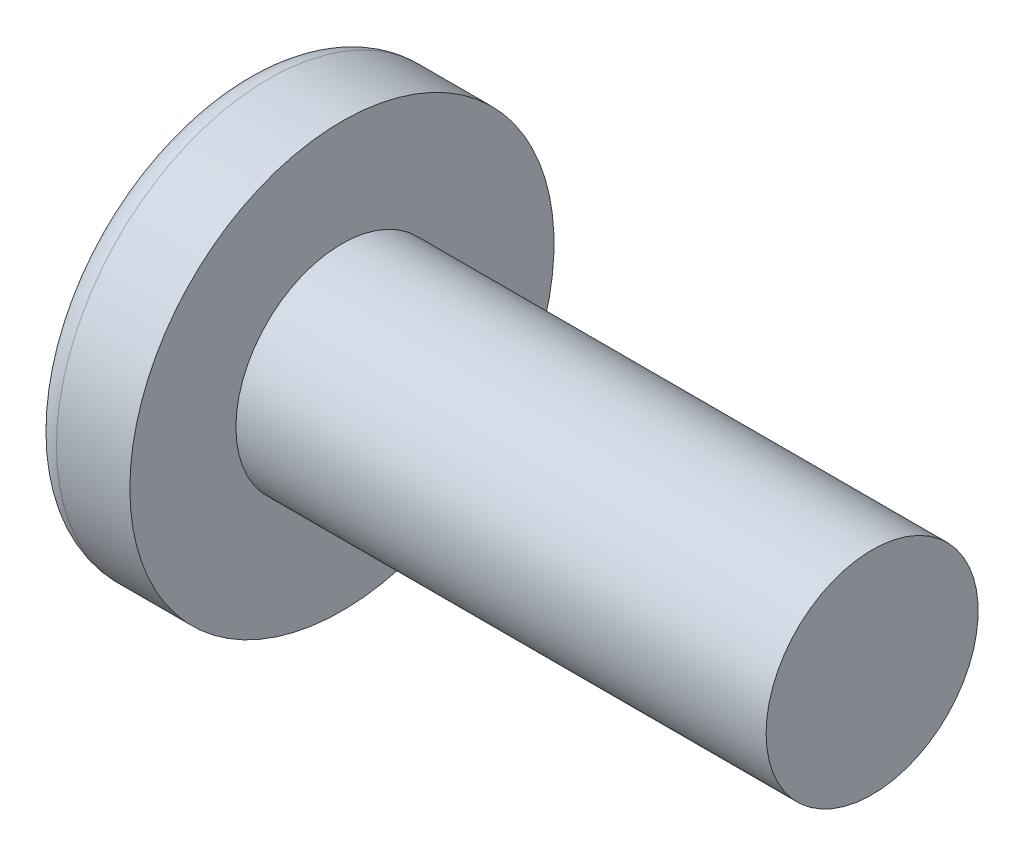
ISO-10303-21;
HEADER;
FILE_DESCRIPTION(('STEP AP214'),'2;1');
FILE_NAME('part.step','',(''),(''),'','','');
FILE_SCHEMA(('AUTOMOTIVE_DESIGN { 1 0 10303 214 1 1 1 1 }'));
ENDSEC;
DATA;
#1=APPLICATION_CONTEXT('core data for automotive mechanical design processes');
#2=APPLICATION_PROTOCOL_DEFINITION('international standard','automotive_design',2000,#1);
#3=PRODUCT_CONTEXT('',#1,'mechanical');
#4=PRODUCT('Part','Part','',(#3));
#5=PRODUCT_RELATED_PRODUCT_CATEGORY('part','',(#4));
#6=PRODUCT_DEFINITION_FORMATION('','',#4);
#7=PRODUCT_DEFINITION_CONTEXT('part definition',#1,'design');
#8=PRODUCT_DEFINITION('design','',#6,#7);
#9=PRODUCT_DEFINITION_SHAPE('','',#8);
#10=(LENGTH_UNIT() NAMED_UNIT(*) SI_UNIT(.MILLI.,.METRE.));
#11=(NAMED_UNIT(*) PLANE_ANGLE_UNIT() SI_UNIT($,.RADIAN.));
#12=(NAMED_UNIT(*) SI_UNIT($,.STERADIAN.) SOLID_ANGLE_UNIT());
#13=UNCERTAINTY_MEASURE_WITH_UNIT(LENGTH_MEASURE(1.E-05),#10,'distance_accuracy_value','');
#14=(GEOMETRIC_REPRESENTATION_CONTEXT(3) GLOBAL_UNCERTAINTY_ASSIGNED_CONTEXT((#13)) GLOBAL_UNIT_ASSIGNED_CONTEXT((#10,
#11,#12)) REPRESENTATION_CONTEXT('',''));
#15=CARTESIAN_POINT('',(0.,0.,0.));
#16=DIRECTION('',(0.,0.,1.));
#17=DIRECTION('',(1.,0.,0.));
#18=AXIS2_PLACEMENT_3D('',#15,#16,#17);
#19=CARTESIAN_POINT('',(13.,0.,0.));
#20=DIRECTION('',(-1.,0.,0.));
#21=DIRECTION('',(0.,1.,0.));
#22=AXIS2_PLACEMENT_3D('',#19,#20,#21);
#23=SPHERICAL_SURFACE('',#22,13.);
#24=CARTESIAN_POINT('',(2.45392021182909,0.,0.));
#25=DIRECTION('',(-1.,0.,0.));
#26=DIRECTION('',(0.,0.,1.));
#27=AXIS2_PLACEMENT_3D('',#24,#25,#26);
#28=CIRCLE('',#27,7.60132890365449);
#29=CARTESIAN_POINT('',(2.45392021182909,0.,7.60132890365449));
#30=VERTEX_POINT('',#29);
#31=EDGE_CURVE('E153',#30,#30,#28,.T.);
#32=ORIENTED_EDGE('',*,*,#31,.T.);
#33=EDGE_LOOP('',(#32));
#34=FACE_BOUND('',#33,.T.);
#35=CARTESIAN_POINT('',(12.9758945313263,-0.27842529497651,0.));
#36=DIRECTION('',(-0.0862551996530427,-0.996273075282482,0.));
#37=DIRECTION('',(0.996273075282482,-0.0862551996530427,0.));
#38=AXIS2_PLACEMENT_3D('',#35,#36,#37);
#39=CIRCLE('',#38,12.9969957406124);
#40=CARTESIAN_POINT('',(0.645878886985406,0.789081182427992,3.96901025603426));
#41=VERTEX_POINT('',#40);
#42=CARTESIAN_POINT('',(0.0544280526445055,0.840287735196246,0.840287735196249));
#43=VERTEX_POINT('',#42);
#44=EDGE_CURVE('E184',#41,#43,#39,.T.);
#45=ORIENTED_EDGE('',*,*,#44,.F.);
#46=CARTESIAN_POINT('',(9.86001716040755,0.,-3.7487746195012));
#47=DIRECTION('',(0.642113836175469,0.,0.766609301660254));
#48=DIRECTION('',(0.766609301660254,0.,-0.642113836175469));
#49=AXIS2_PLACEMENT_3D('',#46,#47,#48);
#50=CIRCLE('',#49,12.0452146771757);
#51=CARTESIAN_POINT('',(0.645878886985406,-0.789081182428019,3.96901025603425));
#52=VERTEX_POINT('',#51);
#53=EDGE_CURVE('E149',#41,#52,#50,.T.);
#54=ORIENTED_EDGE('',*,*,#53,.T.);
#55=CARTESIAN_POINT('',(12.9758945313263,0.27842529497651,0.));
#56=DIRECTION('',(-0.0862551996530427,0.996273075282482,0.));
#57=DIRECTION('',(-0.996273075282482,-0.0862551996530427,0.));
#58=AXIS2_PLACEMENT_3D('',#55,#56,#57);
#59=CIRCLE('',#58,12.9969957406124);
#60=CARTESIAN_POINT('',(0.0544280526445073,-0.840287735196252,0.840287735196249));
#61=VERTEX_POINT('',#60);
#62=EDGE_CURVE('E105',#61,#52,#59,.T.);
#63=ORIENTED_EDGE('',*,*,#62,.F.);
#64=CARTESIAN_POINT('',(12.9758945313263,0.,-0.27842529497651));
#65=DIRECTION('',(-0.0862551996530427,0.,-0.996273075282482));
#66=DIRECTION('',(-0.996273075282482,0.,0.0862551996530427));
#67=AXIS2_PLACEMENT_3D('',#64,#65,#66);
#68=CIRCLE('',#67,12.9969957406124);
#69=CARTESIAN_POINT('',(0.645878886985404,-3.96901025603425,0.789081182428005));
#70=VERTEX_POINT('',#69);
#71=EDGE_CURVE('E130',#70,#61,#68,.T.);
#72=ORIENTED_EDGE('',*,*,#71,.F.);
#73=CARTESIAN_POINT('',(9.86001716040755,3.7487746195012,0.));
#74=DIRECTION('',(0.642113836175469,-0.766609301660254,0.));
#75=DIRECTION('',(0.766609301660254,0.642113836175469,0.));
#76=AXIS2_PLACEMENT_3D('',#73,#74,#75);
#77=CIRCLE('',#76,12.0452146771757);
#78=CARTESIAN_POINT('',(0.645878886985404,-3.96901025603425,-0.789081182428005));
#79=VERTEX_POINT('',#78);
#80=EDGE_CURVE('E138',#70,#79,#77,.T.);
#81=ORIENTED_EDGE('',*,*,#80,.T.);
#82=CARTESIAN_POINT('',(12.9758945313263,0.,0.27842529497651));
#83=DIRECTION('',(-0.0862551996530427,0.,0.996273075282482));
#84=DIRECTION('',(0.996273075282482,0.,0.0862551996530427));
#85=AXIS2_PLACEMENT_3D('',#82,#83,#84);
#86=CIRCLE('',#85,12.9969957406124);
#87=CARTESIAN_POINT('',(0.0544280526445055,-0.840287735196246,-0.840287735196249));
#88=VERTEX_POINT('',#87);
#89=EDGE_CURVE('E48',#88,#79,#86,.T.);
#90=ORIENTED_EDGE('',*,*,#89,.F.);
#91=CARTESIAN_POINT('',(0.645878886985406,-0.789081182427991,-3.96901025603426));
#92=VERTEX_POINT('',#91);
#93=EDGE_CURVE('E191',#92,#88,#59,.T.);
#94=ORIENTED_EDGE('',*,*,#93,.F.);
#95=CARTESIAN_POINT('',(9.86001716040755,0.,3.7487746195012));
#96=DIRECTION('',(0.642113836175469,0.,-0.766609301660254));
#97=DIRECTION('',(-0.766609301660254,0.,-0.642113836175469));
#98=AXIS2_PLACEMENT_3D('',#95,#96,#97);
#99=CIRCLE('',#98,12.0452146771757);
#100=CARTESIAN_POINT('',(0.645878886985406,0.789081182428019,-3.96901025603425));
#101=VERTEX_POINT('',#100);
#102=EDGE_CURVE('E131',#92,#101,#99,.T.);
#103=ORIENTED_EDGE('',*,*,#102,.T.);
#104=CARTESIAN_POINT('',(0.0544280526445073,0.840287735196252,-0.840287735196249));
#105=VERTEX_POINT('',#104);
#106=EDGE_CURVE('E179',#105,#101,#39,.T.);
#107=ORIENTED_EDGE('',*,*,#106,.F.);
#108=CARTESIAN_POINT('',(0.645878886985406,3.96901025603425,-0.789081182428005));
#109=VERTEX_POINT('',#108);
#110=EDGE_CURVE('E41',#109,#105,#86,.T.);
#111=ORIENTED_EDGE('',*,*,#110,.F.);
#112=CARTESIAN_POINT('',(9.86001716040755,-3.7487746195012,0.));
#113=DIRECTION('',(0.642113836175469,0.766609301660254,0.));
#114=DIRECTION('',(-0.766609301660254,0.642113836175469,0.));
#115=AXIS2_PLACEMENT_3D('',#112,#113,#114);
#116=CIRCLE('',#115,12.0452146771757);
#117=CARTESIAN_POINT('',(0.645878886985406,3.96901025603425,0.789081182428006));
#118=VERTEX_POINT('',#117);
#119=EDGE_CURVE('E11',#109,#118,#116,.T.);
#120=ORIENTED_EDGE('',*,*,#119,.T.);
#121=EDGE_CURVE('E167',#43,#118,#68,.T.);
#122=ORIENTED_EDGE('',*,*,#121,.F.);
#123=EDGE_LOOP('',(#45,#54,#63,#72,#81,#90,#94,#103,#107,#111,#120,#122));
#124=FACE_BOUND('',#123,.T.);
#125=ADVANCED_FACE('F33',(#34,#124),#23,.T.);
#126=CARTESIAN_POINT('',(5.38441590214067,0.,-0.37882874617737));
#127=DIRECTION('',(-0.0862551996530427,0.,0.996273075282482));
#128=DIRECTION('',(0.996273075282482,0.,0.0862551996530427));
#129=AXIS2_PLACEMENT_3D('',#126,#127,#128);
#130=PLANE('',#129);
#131=ORIENTED_EDGE('',*,*,#110,.T.);
#132=DIRECTION('',(0.992587512259711,-0.0859361114610101,0.0859361114610098));
#133=VECTOR('',#132,1.);
#134=CARTESIAN_POINT('',(5.41672965744432,0.376031090108562,-0.37603109010856));
#135=LINE('',#134,#133);
#136=CARTESIAN_POINT('',(4.88,0.422500000000001,-0.422499999999998));
#137=VERTEX_POINT('',#136);
#138=EDGE_CURVE('E173',#105,#137,#135,.T.);
#139=ORIENTED_EDGE('',*,*,#138,.T.);
#140=DIRECTION('',(0.764926340567859,-0.64070418382605,0.0662256923954755));
#141=VECTOR('',#140,1.);
#142=CARTESIAN_POINT('',(0.,4.51,-0.845));
#143=LINE('',#142,#141);
#144=EDGE_CURVE('E154',#109,#137,#143,.T.);
#145=ORIENTED_EDGE('',*,*,#144,.F.);
#146=EDGE_LOOP('',(#131,#139,#145));
#147=FACE_BOUND('',#146,.T.);
#148=ADVANCED_FACE('F172',(#147),#130,.T.);
#149=DIRECTION('',(0.764926340567859,0.64070418382605,0.0662256923954755));
#150=VECTOR('',#149,1.);
#151=CARTESIAN_POINT('',(0.,-4.51,-0.845));
#152=LINE('',#151,#150);
#153=CARTESIAN_POINT('',(4.88,-0.4225,-0.4225));
#154=VERTEX_POINT('',#153);
#155=EDGE_CURVE('E139',#79,#154,#152,.T.);
#156=ORIENTED_EDGE('',*,*,#155,.T.);
#157=DIRECTION('',(-0.992587512259711,-0.0859361114610095,-0.0859361114610098));
#158=VECTOR('',#157,1.);
#159=CARTESIAN_POINT('',(5.41672965744432,-0.376031090108559,-0.37603109010856));
#160=LINE('',#159,#158);
#161=EDGE_CURVE('E194',#154,#88,#160,.T.);
#162=ORIENTED_EDGE('',*,*,#161,.T.);
#163=ORIENTED_EDGE('',*,*,#89,.T.);
#164=EDGE_LOOP('',(#156,#162,#163));
#165=FACE_BOUND('',#164,.T.);
#166=ADVANCED_FACE('F209',(#165),#130,.T.);
#167=CARTESIAN_POINT('',(5.38441590214067,0.,0.37882874617737));
#168=DIRECTION('',(-0.0862551996530427,0.,-0.996273075282482));
#169=DIRECTION('',(-0.996273075282482,0.,0.0862551996530427));
#170=AXIS2_PLACEMENT_3D('',#167,#168,#169);
#171=PLANE('',#170);
#172=DIRECTION('',(0.764926340567859,-0.64070418382605,-0.0662256923954755));
#173=VECTOR('',#172,1.);
#174=CARTESIAN_POINT('',(0.,4.51,0.845));
#175=LINE('',#174,#173);
#176=CARTESIAN_POINT('',(4.88,0.4225,0.4225));
#177=VERTEX_POINT('',#176);
#178=EDGE_CURVE('E210',#118,#177,#175,.T.);
#179=ORIENTED_EDGE('',*,*,#178,.T.);
#180=DIRECTION('',(-0.992587512259711,0.0859361114610095,0.0859361114610098));
#181=VECTOR('',#180,1.);
#182=CARTESIAN_POINT('',(5.41672965744432,0.376031090108559,0.37603109010856));
#183=LINE('',#182,#181);
#184=EDGE_CURVE('E188',#177,#43,#183,.T.);
#185=ORIENTED_EDGE('',*,*,#184,.T.);
#186=ORIENTED_EDGE('',*,*,#121,.T.);
#187=EDGE_LOOP('',(#179,#185,#186));
#188=FACE_BOUND('',#187,.T.);
#189=ADVANCED_FACE('F214',(#188),#171,.T.);
#190=ORIENTED_EDGE('',*,*,#71,.T.);
#191=DIRECTION('',(0.992587512259711,0.0859361114610101,-0.0859361114610097));
#192=VECTOR('',#191,1.);
#193=CARTESIAN_POINT('',(5.41672965744432,-0.376031090108562,0.37603109010856));
#194=LINE('',#193,#192);
#195=CARTESIAN_POINT('',(4.88,-0.422500000000001,0.422499999999998));
#196=VERTEX_POINT('',#195);
#197=EDGE_CURVE('E103',#61,#196,#194,.T.);
#198=ORIENTED_EDGE('',*,*,#197,.T.);
#199=DIRECTION('',(0.764926340567859,0.64070418382605,-0.0662256923954754));
#200=VECTOR('',#199,1.);
#201=CARTESIAN_POINT('',(0.,-4.51,0.844999999999999));
#202=LINE('',#201,#200);
#203=EDGE_CURVE('E128',#70,#196,#202,.T.);
#204=ORIENTED_EDGE('',*,*,#203,.F.);
#205=EDGE_LOOP('',(#190,#198,#204));
#206=FACE_BOUND('',#205,.T.);
#207=ADVANCED_FACE('F127',(#206),#171,.T.);
#208=CARTESIAN_POINT('',(-25.4,0.,0.));
#209=DIRECTION('',(-1.,0.,0.));
#210=DIRECTION('',(0.,0.,1.));
#211=AXIS2_PLACEMENT_3D('',#208,#209,#210);
#212=CYLINDRICAL_SURFACE('',#211,4.);
#213=CARTESIAN_POINT('',(26.,0.,0.));
#214=DIRECTION('',(-1.,0.,0.));
#215=DIRECTION('',(0.,0.,1.));
#216=AXIS2_PLACEMENT_3D('',#213,#214,#215);
#217=CIRCLE('',#216,4.);
#218=CARTESIAN_POINT('',(26.,0.,4.));
#219=VERTEX_POINT('',#218);
#220=EDGE_CURVE('E150',#219,#219,#217,.T.);
#221=ORIENTED_EDGE('',*,*,#220,.T.);
#222=EDGE_LOOP('',(#221));
#223=FACE_BOUND('',#222,.T.);
#224=CARTESIAN_POINT('',(6.,0.,0.));
#225=DIRECTION('',(-1.,0.,0.));
#226=DIRECTION('',(0.,0.,1.));
#227=AXIS2_PLACEMENT_3D('',#224,#225,#226);
#228=CIRCLE('',#227,4.);
#229=CARTESIAN_POINT('',(6.,0.,4.));
#230=VERTEX_POINT('',#229);
#231=EDGE_CURVE('E163',#230,#230,#228,.T.);
#232=ORIENTED_EDGE('',*,*,#231,.F.);
#233=EDGE_LOOP('',(#232));
#234=FACE_BOUND('',#233,.T.);
#235=ADVANCED_FACE('F35',(#223,#234),#212,.T.);
#236=CARTESIAN_POINT('',(6.,4.,0.));
#237=DIRECTION('',(-1.,0.,0.));
#238=DIRECTION('',(0.,0.,1.));
#239=AXIS2_PLACEMENT_3D('',#236,#237,#238);
#240=PLANE('',#239);
#241=CARTESIAN_POINT('',(6.,0.,0.));
#242=DIRECTION('',(-1.,0.,0.));
#243=DIRECTION('',(0.,0.,1.));
#244=AXIS2_PLACEMENT_3D('',#241,#242,#243);
#245=CIRCLE('',#244,8.);
#246=CARTESIAN_POINT('',(6.,0.,8.));
#247=VERTEX_POINT('',#246);
#248=EDGE_CURVE('E160',#247,#247,#245,.T.);
#249=ORIENTED_EDGE('',*,*,#248,.F.);
#250=EDGE_LOOP('',(#249));
#251=FACE_BOUND('',#250,.T.);
#252=ORIENTED_EDGE('',*,*,#231,.T.);
#253=EDGE_LOOP('',(#252));
#254=FACE_BOUND('',#253,.T.);
#255=ADVANCED_FACE('F242',(#251,#254),#240,.F.);
#256=CARTESIAN_POINT('',(-25.4,0.,0.));
#257=DIRECTION('',(-1.,0.,0.));
#258=DIRECTION('',(0.,0.,1.));
#259=AXIS2_PLACEMENT_3D('',#256,#257,#258);
#260=CYLINDRICAL_SURFACE('',#259,8.);
#261=ORIENTED_EDGE('',*,*,#248,.T.);
#262=EDGE_LOOP('',(#261));
#263=FACE_BOUND('',#262,.T.);
#264=CARTESIAN_POINT('',(3.23270764234018,0.,0.));
#265=DIRECTION('',(-1.,0.,0.));
#266=DIRECTION('',(0.,0.,1.));
#267=AXIS2_PLACEMENT_3D('',#264,#265,#266);
#268=CIRCLE('',#267,8.);
#269=CARTESIAN_POINT('',(3.23270764234018,0.,8.));
#270=VERTEX_POINT('',#269);
#271=EDGE_CURVE('E157',#270,#270,#268,.T.);
#272=ORIENTED_EDGE('',*,*,#271,.F.);
#273=EDGE_LOOP('',(#272));
#274=FACE_BOUND('',#273,.T.);
#275=ADVANCED_FACE('F239',(#263,#274),#260,.T.);
#276=CARTESIAN_POINT('',(3.23270764234018,0.,0.));
#277=DIRECTION('',(-1.,0.,0.));
#278=DIRECTION('',(0.,0.,1.));
#279=AXIS2_PLACEMENT_3D('',#276,#277,#278);
#280=TOROIDAL_SURFACE('',#279,7.04,0.960000000000001);
#281=ORIENTED_EDGE('',*,*,#271,.T.);
#282=EDGE_LOOP('',(#281));
#283=FACE_BOUND('',#282,.T.);
#284=ORIENTED_EDGE('',*,*,#31,.F.);
#285=EDGE_LOOP('',(#284));
#286=FACE_BOUND('',#285,.T.);
#287=ADVANCED_FACE('F236',(#283,#286),#280,.T.);
#288=CARTESIAN_POINT('',(26.,4.,0.));
#289=DIRECTION('',(1.,0.,0.));
#290=DIRECTION('',(0.,0.,-1.));
#291=AXIS2_PLACEMENT_3D('',#288,#289,#290);
#292=PLANE('',#291);
#293=ORIENTED_EDGE('',*,*,#220,.F.);
#294=EDGE_LOOP('',(#293));
#295=FACE_BOUND('',#294,.T.);
#296=ADVANCED_FACE('F234',(#295),#292,.T.);
#297=CARTESIAN_POINT('',(4.88,0.4225,0.4225));
#298=DIRECTION('',(0.642113836175469,0.766609301660254,0.));
#299=DIRECTION('',(-0.766609301660254,0.642113836175469,0.));
#300=AXIS2_PLACEMENT_3D('',#297,#298,#299);
#301=PLANE('',#300);
#302=ORIENTED_EDGE('',*,*,#144,.T.);
#303=DIRECTION('',(0.,0.,-1.));
#304=VECTOR('',#303,1.);
#305=CARTESIAN_POINT('',(4.88,0.4225,0.4225));
#306=LINE('',#305,#304);
#307=EDGE_CURVE('E121',#177,#137,#306,.T.);
#308=ORIENTED_EDGE('',*,*,#307,.F.);
#309=ORIENTED_EDGE('',*,*,#178,.F.);
#310=ORIENTED_EDGE('',*,*,#119,.F.);
#311=EDGE_LOOP('',(#302,#308,#309,#310));
#312=FACE_BOUND('',#311,.T.);
#313=ADVANCED_FACE('F213',(#312),#301,.F.);
#314=CARTESIAN_POINT('',(4.88,-0.4225,-0.4225));
#315=DIRECTION('',(0.642113836175469,-0.766609301660254,0.));
#316=DIRECTION('',(0.766609301660254,0.642113836175469,0.));
#317=AXIS2_PLACEMENT_3D('',#314,#315,#316);
#318=PLANE('',#317);
#319=ORIENTED_EDGE('',*,*,#203,.T.);
#320=DIRECTION('',(0.,0.,1.));
#321=VECTOR('',#320,1.);
#322=CARTESIAN_POINT('',(4.88,-0.4225,-0.4225));
#323=LINE('',#322,#321);
#324=EDGE_CURVE('E120',#154,#196,#323,.T.);
#325=ORIENTED_EDGE('',*,*,#324,.F.);
#326=ORIENTED_EDGE('',*,*,#155,.F.);
#327=ORIENTED_EDGE('',*,*,#80,.F.);
#328=EDGE_LOOP('',(#319,#325,#326,#327));
#329=FACE_BOUND('',#328,.T.);
#330=ADVANCED_FACE('F135',(#329),#318,.F.);
#331=CARTESIAN_POINT('',(4.88,0.4225,-0.4225));
#332=DIRECTION('',(-1.,0.,0.));
#333=DIRECTION('',(0.,0.,1.));
#334=AXIS2_PLACEMENT_3D('',#331,#332,#333);
#335=PLANE('',#334);
#336=DIRECTION('',(0.,1.,0.));
#337=VECTOR('',#336,1.);
#338=CARTESIAN_POINT('',(4.88,-0.4225,-0.4225));
#339=LINE('',#338,#337);
#340=EDGE_CURVE('E143',#154,#137,#339,.T.);
#341=ORIENTED_EDGE('',*,*,#340,.F.);
#342=ORIENTED_EDGE('',*,*,#324,.T.);
#343=DIRECTION('',(0.,-1.,0.));
#344=VECTOR('',#343,1.);
#345=CARTESIAN_POINT('',(4.88,0.4225,0.4225));
#346=LINE('',#345,#344);
#347=EDGE_CURVE('E112',#177,#196,#346,.T.);
#348=ORIENTED_EDGE('',*,*,#347,.F.);
#349=ORIENTED_EDGE('',*,*,#307,.T.);
#350=EDGE_LOOP('',(#341,#342,#348,#349));
#351=FACE_BOUND('',#350,.T.);
#352=ADVANCED_FACE('F141',(#351),#335,.T.);
#353=CARTESIAN_POINT('',(4.88,0.422500000000001,-0.422499999999998));
#354=DIRECTION('',(0.642113836175469,0.,-0.766609301660254));
#355=DIRECTION('',(0.766609301660254,0.,0.642113836175469));
#356=AXIS2_PLACEMENT_3D('',#353,#354,#355);
#357=PLANE('',#356);
#358=DIRECTION('',(0.764926340567859,0.0662256923954731,0.64070418382605));
#359=VECTOR('',#358,1.);
#360=CARTESIAN_POINT('',(0.,-0.844999999999983,-4.51));
#361=LINE('',#360,#359);
#362=EDGE_CURVE('E199',#92,#154,#361,.T.);
#363=ORIENTED_EDGE('',*,*,#362,.T.);
#364=ORIENTED_EDGE('',*,*,#340,.T.);
#365=DIRECTION('',(0.764926340567859,-0.0662256923954777,0.640704183826049));
#366=VECTOR('',#365,1.);
#367=CARTESIAN_POINT('',(0.,0.845000000000016,-4.51));
#368=LINE('',#367,#366);
#369=EDGE_CURVE('E109',#101,#137,#368,.T.);
#370=ORIENTED_EDGE('',*,*,#369,.F.);
#371=ORIENTED_EDGE('',*,*,#102,.F.);
#372=EDGE_LOOP('',(#363,#364,#370,#371));
#373=FACE_BOUND('',#372,.T.);
#374=ADVANCED_FACE('F204',(#373),#357,.F.);
#375=CARTESIAN_POINT('',(5.38441590214067,-0.37882874617737,0.));
#376=DIRECTION('',(-0.0862551996530427,0.996273075282482,0.));
#377=DIRECTION('',(-0.996273075282482,-0.0862551996530427,0.));
#378=AXIS2_PLACEMENT_3D('',#375,#376,#377);
#379=PLANE('',#378);
#380=ORIENTED_EDGE('',*,*,#93,.T.);
#381=ORIENTED_EDGE('',*,*,#161,.F.);
#382=ORIENTED_EDGE('',*,*,#362,.F.);
#383=EDGE_LOOP('',(#380,#381,#382));
#384=FACE_BOUND('',#383,.T.);
#385=ADVANCED_FACE('F208',(#384),#379,.T.);
#386=CARTESIAN_POINT('',(5.38441590214067,0.37882874617737,0.));
#387=DIRECTION('',(-0.0862551996530427,-0.996273075282482,0.));
#388=DIRECTION('',(0.996273075282482,-0.0862551996530427,0.));
#389=AXIS2_PLACEMENT_3D('',#386,#387,#388);
#390=PLANE('',#389);
#391=ORIENTED_EDGE('',*,*,#106,.T.);
#392=ORIENTED_EDGE('',*,*,#369,.T.);
#393=ORIENTED_EDGE('',*,*,#138,.F.);
#394=EDGE_LOOP('',(#391,#392,#393));
#395=FACE_BOUND('',#394,.T.);
#396=ADVANCED_FACE('F202',(#395),#390,.T.);
#397=CARTESIAN_POINT('',(4.88,-0.422500000000001,0.422499999999998));
#398=DIRECTION('',(0.642113836175469,0.,0.766609301660254));
#399=DIRECTION('',(-0.766609301660254,0.,0.642113836175469));
#400=AXIS2_PLACEMENT_3D('',#397,#398,#399);
#401=PLANE('',#400);
#402=DIRECTION('',(0.764926340567859,-0.0662256923954732,-0.64070418382605));
#403=VECTOR('',#402,1.);
#404=CARTESIAN_POINT('',(0.,0.844999999999984,4.51));
#405=LINE('',#404,#403);
#406=EDGE_CURVE('E108',#41,#177,#405,.T.);
#407=ORIENTED_EDGE('',*,*,#406,.T.);
#408=ORIENTED_EDGE('',*,*,#347,.T.);
#409=DIRECTION('',(0.764926340567859,0.0662256923954778,-0.640704183826049));
#410=VECTOR('',#409,1.);
#411=CARTESIAN_POINT('',(0.,-0.845000000000016,4.51));
#412=LINE('',#411,#410);
#413=EDGE_CURVE('E99',#52,#196,#412,.T.);
#414=ORIENTED_EDGE('',*,*,#413,.F.);
#415=ORIENTED_EDGE('',*,*,#53,.F.);
#416=EDGE_LOOP('',(#407,#408,#414,#415));
#417=FACE_BOUND('',#416,.T.);
#418=ADVANCED_FACE('F113',(#417),#401,.F.);
#419=ORIENTED_EDGE('',*,*,#44,.T.);
#420=ORIENTED_EDGE('',*,*,#184,.F.);
#421=ORIENTED_EDGE('',*,*,#406,.F.);
#422=EDGE_LOOP('',(#419,#420,#421));
#423=FACE_BOUND('',#422,.T.);
#424=ADVANCED_FACE('F215',(#423),#390,.T.);
#425=ORIENTED_EDGE('',*,*,#62,.T.);
#426=ORIENTED_EDGE('',*,*,#413,.T.);
#427=ORIENTED_EDGE('',*,*,#197,.F.);
#428=EDGE_LOOP('',(#425,#426,#427));
#429=FACE_BOUND('',#428,.T.);
#430=ADVANCED_FACE('F101',(#429),#379,.T.);
#431=CLOSED_SHELL('',(#125,#148,#166,#189,#207,#235,#255,#275,#287,#296,#313,#330,#352,#374,
#385,#396,#418,#424,#430));
#432=MANIFOLD_SOLID_BREP('B2',#431);
#433=ADVANCED_BREP_SHAPE_REPRESENTATION('',(#18,#432),#14);
#434=SHAPE_DEFINITION_REPRESENTATION(#9,#433);
ENDSEC;
END-ISO-10303-21;
